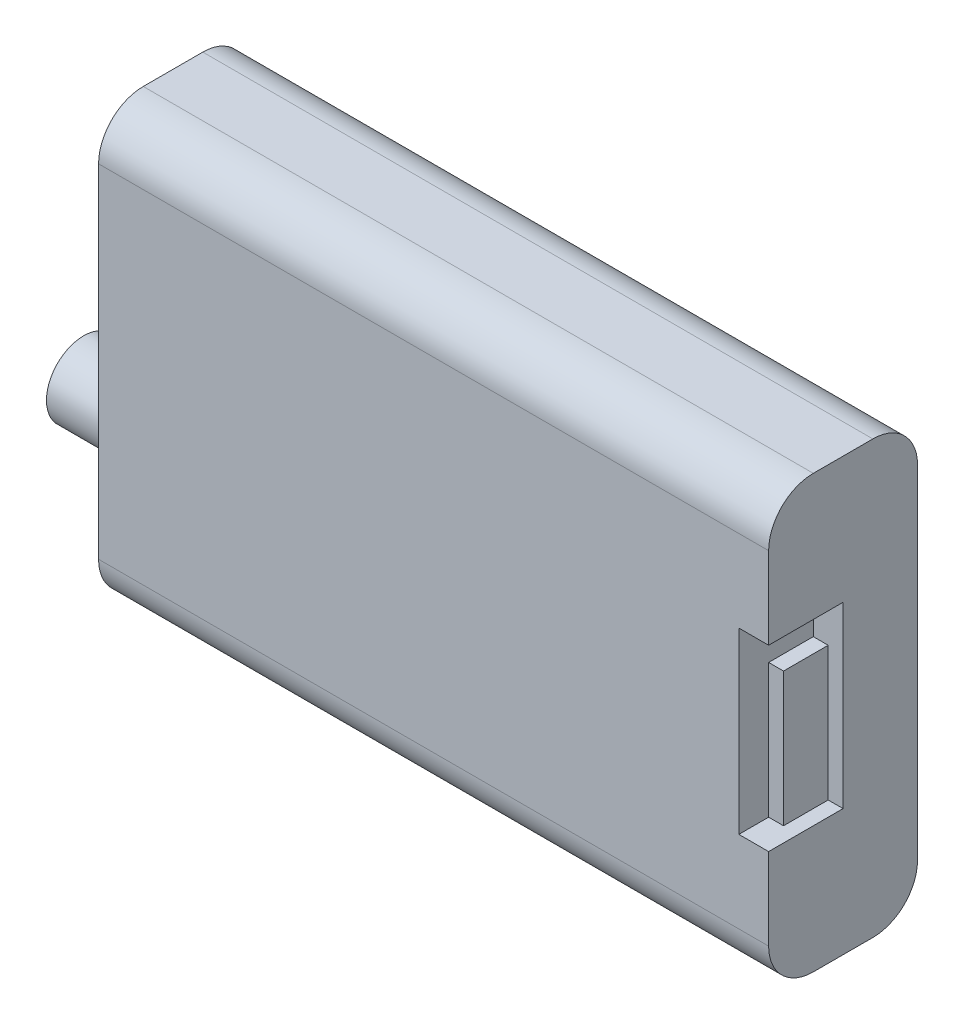
ISO-10303-21;
HEADER;
FILE_DESCRIPTION(('STEP AP214'),'2;1');
FILE_NAME('part.step','',(''),(''),'','','');
FILE_SCHEMA(('AUTOMOTIVE_DESIGN { 1 0 10303 214 1 1 1 1 }'));
ENDSEC;
DATA;
#1=APPLICATION_CONTEXT('core data for automotive mechanical design processes');
#2=APPLICATION_PROTOCOL_DEFINITION('international standard','automotive_design',2000,#1);
#3=PRODUCT_CONTEXT('',#1,'mechanical');
#4=PRODUCT('Part','Part','',(#3));
#5=PRODUCT_RELATED_PRODUCT_CATEGORY('part','',(#4));
#6=PRODUCT_DEFINITION_FORMATION('','',#4);
#7=PRODUCT_DEFINITION_CONTEXT('part definition',#1,'design');
#8=PRODUCT_DEFINITION('design','',#6,#7);
#9=PRODUCT_DEFINITION_SHAPE('','',#8);
#10=(LENGTH_UNIT() NAMED_UNIT(*) SI_UNIT(.MILLI.,.METRE.));
#11=(NAMED_UNIT(*) PLANE_ANGLE_UNIT() SI_UNIT($,.RADIAN.));
#12=(NAMED_UNIT(*) SI_UNIT($,.STERADIAN.) SOLID_ANGLE_UNIT());
#13=UNCERTAINTY_MEASURE_WITH_UNIT(LENGTH_MEASURE(1.E-05),#10,'distance_accuracy_value','');
#14=(GEOMETRIC_REPRESENTATION_CONTEXT(3) GLOBAL_UNCERTAINTY_ASSIGNED_CONTEXT((#13)) GLOBAL_UNIT_ASSIGNED_CONTEXT((#10,
#11,#12)) REPRESENTATION_CONTEXT('',''));
#15=CARTESIAN_POINT('',(0.,0.,0.));
#16=DIRECTION('',(0.,0.,1.));
#17=DIRECTION('',(1.,0.,0.));
#18=AXIS2_PLACEMENT_3D('',#15,#16,#17);
#19=CARTESIAN_POINT('',(-24.5,-6.5,5.));
#20=DIRECTION('',(-1.,0.,0.));
#21=DIRECTION('',(0.,0.,1.));
#22=AXIS2_PLACEMENT_3D('',#19,#20,#21);
#23=PLANE('',#22);
#24=CARTESIAN_POINT('',(-24.5,-6.5,5.));
#25=DIRECTION('',(-1.,0.,0.));
#26=DIRECTION('',(0.,0.,1.));
#27=AXIS2_PLACEMENT_3D('',#24,#25,#26);
#28=CIRCLE('',#27,1.85);
#29=CARTESIAN_POINT('',(-24.5,-6.5,6.85));
#30=VERTEX_POINT('',#29);
#31=EDGE_CURVE('E487',#30,#30,#28,.T.);
#32=ORIENTED_EDGE('',*,*,#31,.T.);
#33=EDGE_LOOP('',(#32));
#34=FACE_BOUND('',#33,.T.);
#35=CARTESIAN_POINT('',(-24.5,-6.5,5.));
#36=DIRECTION('',(-1.,0.,0.));
#37=DIRECTION('',(0.,0.,1.));
#38=AXIS2_PLACEMENT_3D('',#35,#36,#37);
#39=CIRCLE('',#38,0.275);
#40=CARTESIAN_POINT('',(-24.5,-6.5,5.275));
#41=VERTEX_POINT('',#40);
#42=EDGE_CURVE('E484',#41,#41,#39,.T.);
#43=ORIENTED_EDGE('',*,*,#42,.F.);
#44=EDGE_LOOP('',(#43));
#45=FACE_BOUND('',#44,.T.);
#46=ADVANCED_FACE('F33',(#34,#45),#23,.T.);
#47=CARTESIAN_POINT('',(-22.5,-14.5,10.));
#48=DIRECTION('',(1.,0.,0.));
#49=DIRECTION('',(0.,0.,-1.));
#50=AXIS2_PLACEMENT_3D('',#47,#48,#49);
#51=PLANE('',#50);
#52=DIRECTION('',(0.,0.,-1.));
#53=VECTOR('',#52,1.);
#54=CARTESIAN_POINT('',(-22.5,-14.5,10.));
#55=LINE('',#54,#53);
#56=CARTESIAN_POINT('',(-22.5,-14.5,7.));
#57=VERTEX_POINT('',#56);
#58=CARTESIAN_POINT('',(-22.5,-14.5,3.));
#59=VERTEX_POINT('',#58);
#60=EDGE_CURVE('E216',#57,#59,#55,.T.);
#61=ORIENTED_EDGE('',*,*,#60,.F.);
#62=CARTESIAN_POINT('',(-22.5,-11.5,7.));
#63=DIRECTION('',(1.,0.,0.));
#64=DIRECTION('',(0.,0.,-1.));
#65=AXIS2_PLACEMENT_3D('',#62,#63,#64);
#66=CIRCLE('',#65,3.);
#67=CARTESIAN_POINT('',(-22.5,-11.5,10.));
#68=VERTEX_POINT('',#67);
#69=EDGE_CURVE('E11',#57,#68,#66,.F.);
#70=ORIENTED_EDGE('',*,*,#69,.T.);
#71=DIRECTION('',(0.,-1.,0.));
#72=VECTOR('',#71,1.);
#73=CARTESIAN_POINT('',(-22.5,-14.5,10.));
#74=LINE('',#73,#72);
#75=CARTESIAN_POINT('',(-22.5,11.5,10.));
#76=VERTEX_POINT('',#75);
#77=EDGE_CURVE('E206',#76,#68,#74,.T.);
#78=ORIENTED_EDGE('',*,*,#77,.F.);
#79=CARTESIAN_POINT('',(-22.5,11.5,7.));
#80=DIRECTION('',(1.,0.,0.));
#81=DIRECTION('',(0.,0.,-1.));
#82=AXIS2_PLACEMENT_3D('',#79,#80,#81);
#83=CIRCLE('',#82,3.);
#84=CARTESIAN_POINT('',(-22.5,14.5,7.));
#85=VERTEX_POINT('',#84);
#86=EDGE_CURVE('E239',#76,#85,#83,.F.);
#87=ORIENTED_EDGE('',*,*,#86,.T.);
#88=DIRECTION('',(0.,0.,-1.));
#89=VECTOR('',#88,1.);
#90=CARTESIAN_POINT('',(-22.5,14.5,10.));
#91=LINE('',#90,#89);
#92=CARTESIAN_POINT('',(-22.5,14.5,3.));
#93=VERTEX_POINT('',#92);
#94=EDGE_CURVE('E218',#85,#93,#91,.T.);
#95=ORIENTED_EDGE('',*,*,#94,.T.);
#96=CARTESIAN_POINT('',(-22.5,11.5,3.));
#97=DIRECTION('',(1.,0.,0.));
#98=DIRECTION('',(0.,0.,-1.));
#99=AXIS2_PLACEMENT_3D('',#96,#97,#98);
#100=CIRCLE('',#99,3.);
#101=CARTESIAN_POINT('',(-22.5,11.5,0.));
#102=VERTEX_POINT('',#101);
#103=EDGE_CURVE('E228',#93,#102,#100,.F.);
#104=ORIENTED_EDGE('',*,*,#103,.T.);
#105=DIRECTION('',(0.,-1.,0.));
#106=VECTOR('',#105,1.);
#107=CARTESIAN_POINT('',(-22.5,-14.5,0.));
#108=LINE('',#107,#106);
#109=CARTESIAN_POINT('',(-22.5,-11.5,0.));
#110=VERTEX_POINT('',#109);
#111=EDGE_CURVE('E212',#102,#110,#108,.T.);
#112=ORIENTED_EDGE('',*,*,#111,.T.);
#113=CARTESIAN_POINT('',(-22.5,-11.5,3.));
#114=DIRECTION('',(1.,0.,0.));
#115=DIRECTION('',(0.,0.,-1.));
#116=AXIS2_PLACEMENT_3D('',#113,#114,#115);
#117=CIRCLE('',#116,3.);
#118=EDGE_CURVE('E252',#110,#59,#117,.F.);
#119=ORIENTED_EDGE('',*,*,#118,.T.);
#120=EDGE_LOOP('',(#61,#70,#78,#87,#95,#104,#112,#119));
#121=FACE_BOUND('',#120,.T.);
#122=CARTESIAN_POINT('',(-22.5,-6.5,5.));
#123=DIRECTION('',(1.,0.,0.));
#124=DIRECTION('',(0.,0.,-1.));
#125=AXIS2_PLACEMENT_3D('',#122,#123,#124);
#126=CIRCLE('',#125,2.5);
#127=CARTESIAN_POINT('',(-22.5,-6.5,2.5));
#128=VERTEX_POINT('',#127);
#129=EDGE_CURVE('E222',#128,#128,#126,.F.);
#130=ORIENTED_EDGE('',*,*,#129,.F.);
#131=EDGE_LOOP('',(#130));
#132=FACE_BOUND('',#131,.T.);
#133=ADVANCED_FACE('F286',(#121,#132),#51,.F.);
#134=CARTESIAN_POINT('',(22.5,-6.,5.));
#135=DIRECTION('',(0.,-1.,0.));
#136=DIRECTION('',(0.,0.,-1.));
#137=AXIS2_PLACEMENT_3D('',#134,#135,#136);
#138=PLANE('',#137);
#139=DIRECTION('',(-1.,0.,0.));
#140=VECTOR('',#139,1.);
#141=CARTESIAN_POINT('',(21.5,-6.,8.));
#142=LINE('',#141,#140);
#143=CARTESIAN_POINT('',(21.5,-6.,8.));
#144=VERTEX_POINT('',#143);
#145=CARTESIAN_POINT('',(20.5,-6.,8.));
#146=VERTEX_POINT('',#145);
#147=EDGE_CURVE('E151',#144,#146,#142,.T.);
#148=ORIENTED_EDGE('',*,*,#147,.T.);
#149=DIRECTION('',(0.,0.,1.));
#150=VECTOR('',#149,1.);
#151=CARTESIAN_POINT('',(20.5,-6.,5.));
#152=LINE('',#151,#150);
#153=CARTESIAN_POINT('',(20.5,-6.,10.));
#154=VERTEX_POINT('',#153);
#155=EDGE_CURVE('E199',#146,#154,#152,.T.);
#156=ORIENTED_EDGE('',*,*,#155,.T.);
#157=DIRECTION('',(1.,0.,0.));
#158=VECTOR('',#157,1.);
#159=CARTESIAN_POINT('',(22.5,-6.,10.));
#160=LINE('',#159,#158);
#161=CARTESIAN_POINT('',(22.5,-6.,10.));
#162=VERTEX_POINT('',#161);
#163=EDGE_CURVE('E180',#154,#162,#160,.T.);
#164=ORIENTED_EDGE('',*,*,#163,.T.);
#165=DIRECTION('',(0.,0.,1.));
#166=VECTOR('',#165,1.);
#167=CARTESIAN_POINT('',(22.5,-6.,5.));
#168=LINE('',#167,#166);
#169=CARTESIAN_POINT('',(22.5,-6.,5.));
#170=VERTEX_POINT('',#169);
#171=EDGE_CURVE('E195',#170,#162,#168,.T.);
#172=ORIENTED_EDGE('',*,*,#171,.F.);
#173=DIRECTION('',(1.,0.,0.));
#174=VECTOR('',#173,1.);
#175=CARTESIAN_POINT('',(22.5,-6.,5.));
#176=LINE('',#175,#174);
#177=CARTESIAN_POINT('',(21.5,-6.,5.));
#178=VERTEX_POINT('',#177);
#179=EDGE_CURVE('E163',#178,#170,#176,.T.);
#180=ORIENTED_EDGE('',*,*,#179,.F.);
#181=DIRECTION('',(0.,0.,-1.));
#182=VECTOR('',#181,1.);
#183=CARTESIAN_POINT('',(21.5,-6.,8.));
#184=LINE('',#183,#182);
#185=EDGE_CURVE('E141',#144,#178,#184,.T.);
#186=ORIENTED_EDGE('',*,*,#185,.F.);
#187=EDGE_LOOP('',(#148,#156,#164,#172,#180,#186));
#188=FACE_BOUND('',#187,.T.);
#189=ADVANCED_FACE('F161',(#188),#138,.F.);
#190=CARTESIAN_POINT('',(20.5,-6.,5.));
#191=DIRECTION('',(-1.,0.,0.));
#192=DIRECTION('',(0.,0.,1.));
#193=AXIS2_PLACEMENT_3D('',#190,#191,#192);
#194=PLANE('',#193);
#195=DIRECTION('',(0.,-1.,0.));
#196=VECTOR('',#195,1.);
#197=CARTESIAN_POINT('',(20.5,-6.,8.));
#198=LINE('',#197,#196);
#199=CARTESIAN_POINT('',(20.5,3.,8.));
#200=VERTEX_POINT('',#199);
#201=EDGE_CURVE('E154',#200,#146,#198,.T.);
#202=ORIENTED_EDGE('',*,*,#201,.F.);
#203=DIRECTION('',(0.,0.,1.));
#204=VECTOR('',#203,1.);
#205=CARTESIAN_POINT('',(20.5,3.,8.));
#206=LINE('',#205,#204);
#207=CARTESIAN_POINT('',(20.5,3.,5.));
#208=VERTEX_POINT('',#207);
#209=EDGE_CURVE('E148',#208,#200,#206,.T.);
#210=ORIENTED_EDGE('',*,*,#209,.F.);
#211=DIRECTION('',(0.,-1.,0.));
#212=VECTOR('',#211,1.);
#213=CARTESIAN_POINT('',(20.5,-6.,5.));
#214=LINE('',#213,#212);
#215=CARTESIAN_POINT('',(20.5,6.,5.));
#216=VERTEX_POINT('',#215);
#217=EDGE_CURVE('E183',#216,#208,#214,.T.);
#218=ORIENTED_EDGE('',*,*,#217,.F.);
#219=DIRECTION('',(0.,0.,1.));
#220=VECTOR('',#219,1.);
#221=CARTESIAN_POINT('',(20.5,6.,5.));
#222=LINE('',#221,#220);
#223=CARTESIAN_POINT('',(20.5,6.,10.));
#224=VERTEX_POINT('',#223);
#225=EDGE_CURVE('E201',#216,#224,#222,.T.);
#226=ORIENTED_EDGE('',*,*,#225,.T.);
#227=DIRECTION('',(0.,-1.,0.));
#228=VECTOR('',#227,1.);
#229=CARTESIAN_POINT('',(20.5,-6.,10.));
#230=LINE('',#229,#228);
#231=EDGE_CURVE('E190',#224,#154,#230,.T.);
#232=ORIENTED_EDGE('',*,*,#231,.T.);
#233=ORIENTED_EDGE('',*,*,#155,.F.);
#234=EDGE_LOOP('',(#202,#210,#218,#226,#232,#233));
#235=FACE_BOUND('',#234,.T.);
#236=ADVANCED_FACE('F273',(#235),#194,.F.);
#237=CARTESIAN_POINT('',(0.,0.,5.));
#238=DIRECTION('',(0.,0.,1.));
#239=DIRECTION('',(1.,0.,0.));
#240=AXIS2_PLACEMENT_3D('',#237,#238,#239);
#241=PLANE('',#240);
#242=ORIENTED_EDGE('',*,*,#217,.T.);
#243=DIRECTION('',(-1.,0.,0.));
#244=VECTOR('',#243,1.);
#245=CARTESIAN_POINT('',(21.5,3.,5.));
#246=LINE('',#245,#244);
#247=CARTESIAN_POINT('',(21.5,3.,5.));
#248=VERTEX_POINT('',#247);
#249=EDGE_CURVE('E158',#248,#208,#246,.T.);
#250=ORIENTED_EDGE('',*,*,#249,.F.);
#251=DIRECTION('',(0.,1.,0.));
#252=VECTOR('',#251,1.);
#253=CARTESIAN_POINT('',(21.5,-6.,5.));
#254=LINE('',#253,#252);
#255=EDGE_CURVE('E164',#178,#248,#254,.T.);
#256=ORIENTED_EDGE('',*,*,#255,.F.);
#257=ORIENTED_EDGE('',*,*,#179,.T.);
#258=DIRECTION('',(0.,1.,0.));
#259=VECTOR('',#258,1.);
#260=CARTESIAN_POINT('',(22.5,-6.,5.));
#261=LINE('',#260,#259);
#262=CARTESIAN_POINT('',(22.5,6.,5.));
#263=VERTEX_POINT('',#262);
#264=EDGE_CURVE('E176',#170,#263,#261,.T.);
#265=ORIENTED_EDGE('',*,*,#264,.T.);
#266=DIRECTION('',(-1.,0.,0.));
#267=VECTOR('',#266,1.);
#268=CARTESIAN_POINT('',(22.5,6.,5.));
#269=LINE('',#268,#267);
#270=EDGE_CURVE('E179',#263,#216,#269,.T.);
#271=ORIENTED_EDGE('',*,*,#270,.T.);
#272=EDGE_LOOP('',(#242,#250,#256,#257,#265,#271));
#273=FACE_BOUND('',#272,.T.);
#274=ADVANCED_FACE('F343',(#273),#241,.T.);
#275=CARTESIAN_POINT('',(22.5,-14.5,10.));
#276=DIRECTION('',(-1.,0.,0.));
#277=DIRECTION('',(0.,0.,1.));
#278=AXIS2_PLACEMENT_3D('',#275,#276,#277);
#279=PLANE('',#278);
#280=DIRECTION('',(0.,1.,0.));
#281=VECTOR('',#280,1.);
#282=CARTESIAN_POINT('',(22.5,-14.5,10.));
#283=LINE('',#282,#281);
#284=CARTESIAN_POINT('',(22.5,-11.5,10.));
#285=VERTEX_POINT('',#284);
#286=EDGE_CURVE('E204',#285,#162,#283,.T.);
#287=ORIENTED_EDGE('',*,*,#286,.F.);
#288=CARTESIAN_POINT('',(22.5,-11.5,7.));
#289=DIRECTION('',(-1.,0.,0.));
#290=DIRECTION('',(0.,0.,1.));
#291=AXIS2_PLACEMENT_3D('',#288,#289,#290);
#292=CIRCLE('',#291,3.);
#293=CARTESIAN_POINT('',(22.5,-14.5,7.));
#294=VERTEX_POINT('',#293);
#295=EDGE_CURVE('E55',#285,#294,#292,.F.);
#296=ORIENTED_EDGE('',*,*,#295,.T.);
#297=DIRECTION('',(0.,0.,-1.));
#298=VECTOR('',#297,1.);
#299=CARTESIAN_POINT('',(22.5,-14.5,10.));
#300=LINE('',#299,#298);
#301=CARTESIAN_POINT('',(22.5,-14.5,3.));
#302=VERTEX_POINT('',#301);
#303=EDGE_CURVE('E210',#294,#302,#300,.T.);
#304=ORIENTED_EDGE('',*,*,#303,.T.);
#305=CARTESIAN_POINT('',(22.5,-11.5,3.));
#306=DIRECTION('',(-1.,0.,0.));
#307=DIRECTION('',(0.,0.,1.));
#308=AXIS2_PLACEMENT_3D('',#305,#306,#307);
#309=CIRCLE('',#308,3.);
#310=CARTESIAN_POINT('',(22.5,-11.5,0.));
#311=VERTEX_POINT('',#310);
#312=EDGE_CURVE('E248',#302,#311,#309,.F.);
#313=ORIENTED_EDGE('',*,*,#312,.T.);
#314=DIRECTION('',(0.,1.,0.));
#315=VECTOR('',#314,1.);
#316=CARTESIAN_POINT('',(22.5,-14.5,0.));
#317=LINE('',#316,#315);
#318=CARTESIAN_POINT('',(22.5,11.5,0.));
#319=VERTEX_POINT('',#318);
#320=EDGE_CURVE('E198',#311,#319,#317,.T.);
#321=ORIENTED_EDGE('',*,*,#320,.T.);
#322=CARTESIAN_POINT('',(22.5,11.5,3.));
#323=DIRECTION('',(-1.,0.,0.));
#324=DIRECTION('',(0.,0.,1.));
#325=AXIS2_PLACEMENT_3D('',#322,#323,#324);
#326=CIRCLE('',#325,3.);
#327=CARTESIAN_POINT('',(22.5,14.5,3.));
#328=VERTEX_POINT('',#327);
#329=EDGE_CURVE('E233',#319,#328,#326,.F.);
#330=ORIENTED_EDGE('',*,*,#329,.T.);
#331=DIRECTION('',(0.,0.,-1.));
#332=VECTOR('',#331,1.);
#333=CARTESIAN_POINT('',(22.5,14.5,10.));
#334=LINE('',#333,#332);
#335=CARTESIAN_POINT('',(22.5,14.5,7.));
#336=VERTEX_POINT('',#335);
#337=EDGE_CURVE('E220',#336,#328,#334,.T.);
#338=ORIENTED_EDGE('',*,*,#337,.F.);
#339=CARTESIAN_POINT('',(22.5,11.5,7.));
#340=DIRECTION('',(-1.,0.,0.));
#341=DIRECTION('',(0.,0.,1.));
#342=AXIS2_PLACEMENT_3D('',#339,#340,#341);
#343=CIRCLE('',#342,3.);
#344=CARTESIAN_POINT('',(22.5,11.5,10.));
#345=VERTEX_POINT('',#344);
#346=EDGE_CURVE('E243',#336,#345,#343,.F.);
#347=ORIENTED_EDGE('',*,*,#346,.T.);
#348=CARTESIAN_POINT('',(22.5,5.99999999999999,10.));
#349=VERTEX_POINT('',#348);
#350=EDGE_CURVE('E207',#349,#345,#283,.T.);
#351=ORIENTED_EDGE('',*,*,#350,.F.);
#352=DIRECTION('',(0.,0.,1.));
#353=VECTOR('',#352,1.);
#354=CARTESIAN_POINT('',(22.5,6.,5.));
#355=LINE('',#354,#353);
#356=EDGE_CURVE('E187',#263,#349,#355,.T.);
#357=ORIENTED_EDGE('',*,*,#356,.F.);
#358=ORIENTED_EDGE('',*,*,#264,.F.);
#359=ORIENTED_EDGE('',*,*,#171,.T.);
#360=EDGE_LOOP('',(#287,#296,#304,#313,#321,#330,#338,#347,#351,#357,#358,#359));
#361=FACE_BOUND('',#360,.T.);
#362=ADVANCED_FACE('F265',(#361),#279,.F.);
#363=CARTESIAN_POINT('',(-22.5,14.5,10.));
#364=DIRECTION('',(0.,-1.,0.));
#365=DIRECTION('',(0.,0.,-1.));
#366=AXIS2_PLACEMENT_3D('',#363,#364,#365);
#367=PLANE('',#366);
#368=ORIENTED_EDGE('',*,*,#94,.F.);
#369=DIRECTION('',(-1.,0.,0.));
#370=VECTOR('',#369,1.);
#371=CARTESIAN_POINT('',(-22.5,14.5,7.));
#372=LINE('',#371,#370);
#373=EDGE_CURVE('E241',#85,#336,#372,.F.);
#374=ORIENTED_EDGE('',*,*,#373,.T.);
#375=ORIENTED_EDGE('',*,*,#337,.T.);
#376=DIRECTION('',(-1.,0.,0.));
#377=VECTOR('',#376,1.);
#378=CARTESIAN_POINT('',(-22.5,14.5,3.));
#379=LINE('',#378,#377);
#380=EDGE_CURVE('E225',#328,#93,#379,.T.);
#381=ORIENTED_EDGE('',*,*,#380,.T.);
#382=EDGE_LOOP('',(#368,#374,#375,#381));
#383=FACE_BOUND('',#382,.T.);
#384=ADVANCED_FACE('F290',(#383),#367,.F.);
#385=CARTESIAN_POINT('',(-22.5,-14.5,10.));
#386=DIRECTION('',(0.,1.,0.));
#387=DIRECTION('',(0.,0.,1.));
#388=AXIS2_PLACEMENT_3D('',#385,#386,#387);
#389=PLANE('',#388);
#390=ORIENTED_EDGE('',*,*,#303,.F.);
#391=DIRECTION('',(1.,0.,0.));
#392=VECTOR('',#391,1.);
#393=CARTESIAN_POINT('',(-22.5,-14.5,7.));
#394=LINE('',#393,#392);
#395=EDGE_CURVE('E41',#294,#57,#394,.F.);
#396=ORIENTED_EDGE('',*,*,#395,.T.);
#397=ORIENTED_EDGE('',*,*,#60,.T.);
#398=DIRECTION('',(1.,0.,0.));
#399=VECTOR('',#398,1.);
#400=CARTESIAN_POINT('',(22.5,-14.5,3.));
#401=LINE('',#400,#399);
#402=EDGE_CURVE('E245',#59,#302,#401,.T.);
#403=ORIENTED_EDGE('',*,*,#402,.T.);
#404=EDGE_LOOP('',(#390,#396,#397,#403));
#405=FACE_BOUND('',#404,.T.);
#406=ADVANCED_FACE('F355',(#405),#389,.F.);
#407=CARTESIAN_POINT('',(0.,0.,10.));
#408=DIRECTION('',(0.,0.,-1.));
#409=DIRECTION('',(-1.,0.,0.));
#410=AXIS2_PLACEMENT_3D('',#407,#408,#409);
#411=PLANE('',#410);
#412=ORIENTED_EDGE('',*,*,#77,.T.);
#413=DIRECTION('',(1.,0.,0.));
#414=VECTOR('',#413,1.);
#415=CARTESIAN_POINT('',(0.,-11.5,10.));
#416=LINE('',#415,#414);
#417=EDGE_CURVE('E255',#68,#285,#416,.T.);
#418=ORIENTED_EDGE('',*,*,#417,.T.);
#419=ORIENTED_EDGE('',*,*,#286,.T.);
#420=ORIENTED_EDGE('',*,*,#163,.F.);
#421=ORIENTED_EDGE('',*,*,#231,.F.);
#422=DIRECTION('',(-1.,0.,0.));
#423=VECTOR('',#422,1.);
#424=CARTESIAN_POINT('',(22.5,6.,10.));
#425=LINE('',#424,#423);
#426=EDGE_CURVE('E157',#349,#224,#425,.T.);
#427=ORIENTED_EDGE('',*,*,#426,.F.);
#428=ORIENTED_EDGE('',*,*,#350,.T.);
#429=DIRECTION('',(-1.,0.,0.));
#430=VECTOR('',#429,1.);
#431=CARTESIAN_POINT('',(0.,11.5,10.));
#432=LINE('',#431,#430);
#433=EDGE_CURVE('E236',#345,#76,#432,.T.);
#434=ORIENTED_EDGE('',*,*,#433,.T.);
#435=EDGE_LOOP('',(#412,#418,#419,#420,#421,#427,#428,#434));
#436=FACE_BOUND('',#435,.T.);
#437=ADVANCED_FACE('F260',(#436),#411,.F.);
#438=CARTESIAN_POINT('',(0.,0.,0.));
#439=DIRECTION('',(0.,0.,-1.));
#440=DIRECTION('',(-1.,0.,0.));
#441=AXIS2_PLACEMENT_3D('',#438,#439,#440);
#442=PLANE('',#441);
#443=ORIENTED_EDGE('',*,*,#320,.F.);
#444=DIRECTION('',(1.,0.,0.));
#445=VECTOR('',#444,1.);
#446=CARTESIAN_POINT('',(-22.5,-11.5,0.));
#447=LINE('',#446,#445);
#448=EDGE_CURVE('E250',#311,#110,#447,.F.);
#449=ORIENTED_EDGE('',*,*,#448,.T.);
#450=ORIENTED_EDGE('',*,*,#111,.F.);
#451=DIRECTION('',(-1.,0.,0.));
#452=VECTOR('',#451,1.);
#453=CARTESIAN_POINT('',(22.5,11.5,0.));
#454=LINE('',#453,#452);
#455=EDGE_CURVE('E230',#102,#319,#454,.F.);
#456=ORIENTED_EDGE('',*,*,#455,.T.);
#457=EDGE_LOOP('',(#443,#449,#450,#456));
#458=FACE_BOUND('',#457,.T.);
#459=ADVANCED_FACE('F300',(#458),#442,.T.);
#460=CARTESIAN_POINT('',(22.5,6.,5.));
#461=DIRECTION('',(0.,1.,0.));
#462=DIRECTION('',(0.,0.,1.));
#463=AXIS2_PLACEMENT_3D('',#460,#461,#462);
#464=PLANE('',#463);
#465=ORIENTED_EDGE('',*,*,#426,.T.);
#466=ORIENTED_EDGE('',*,*,#225,.F.);
#467=ORIENTED_EDGE('',*,*,#270,.F.);
#468=ORIENTED_EDGE('',*,*,#356,.T.);
#469=EDGE_LOOP('',(#465,#466,#467,#468));
#470=FACE_BOUND('',#469,.T.);
#471=ADVANCED_FACE('F277',(#470),#464,.F.);
#472=CARTESIAN_POINT('',(21.5,-6.,8.));
#473=DIRECTION('',(0.,0.,-1.));
#474=DIRECTION('',(-1.,0.,0.));
#475=AXIS2_PLACEMENT_3D('',#472,#473,#474);
#476=PLANE('',#475);
#477=ORIENTED_EDGE('',*,*,#201,.T.);
#478=ORIENTED_EDGE('',*,*,#147,.F.);
#479=DIRECTION('',(0.,-1.,0.));
#480=VECTOR('',#479,1.);
#481=CARTESIAN_POINT('',(21.5,-6.,8.));
#482=LINE('',#481,#480);
#483=CARTESIAN_POINT('',(21.5,3.,8.));
#484=VERTEX_POINT('',#483);
#485=EDGE_CURVE('E137',#484,#144,#482,.T.);
#486=ORIENTED_EDGE('',*,*,#485,.F.);
#487=DIRECTION('',(-1.,0.,0.));
#488=VECTOR('',#487,1.);
#489=CARTESIAN_POINT('',(21.5,3.,8.));
#490=LINE('',#489,#488);
#491=EDGE_CURVE('E170',#484,#200,#490,.T.);
#492=ORIENTED_EDGE('',*,*,#491,.T.);
#493=EDGE_LOOP('',(#477,#478,#486,#492));
#494=FACE_BOUND('',#493,.T.);
#495=ADVANCED_FACE('F152',(#494),#476,.F.);
#496=CARTESIAN_POINT('',(21.5,3.,8.));
#497=DIRECTION('',(0.,-1.,0.));
#498=DIRECTION('',(0.,0.,-1.));
#499=AXIS2_PLACEMENT_3D('',#496,#497,#498);
#500=PLANE('',#499);
#501=ORIENTED_EDGE('',*,*,#209,.T.);
#502=ORIENTED_EDGE('',*,*,#491,.F.);
#503=DIRECTION('',(0.,0.,1.));
#504=VECTOR('',#503,1.);
#505=CARTESIAN_POINT('',(21.5,3.,8.));
#506=LINE('',#505,#504);
#507=EDGE_CURVE('E144',#248,#484,#506,.T.);
#508=ORIENTED_EDGE('',*,*,#507,.F.);
#509=ORIENTED_EDGE('',*,*,#249,.T.);
#510=EDGE_LOOP('',(#501,#502,#508,#509));
#511=FACE_BOUND('',#510,.T.);
#512=ADVANCED_FACE('F337',(#511),#500,.F.);
#513=CARTESIAN_POINT('',(21.5,0.,0.));
#514=DIRECTION('',(-1.,0.,0.));
#515=DIRECTION('',(0.,0.,1.));
#516=AXIS2_PLACEMENT_3D('',#513,#514,#515);
#517=PLANE('',#516);
#518=ORIENTED_EDGE('',*,*,#485,.T.);
#519=ORIENTED_EDGE('',*,*,#185,.T.);
#520=ORIENTED_EDGE('',*,*,#255,.T.);
#521=ORIENTED_EDGE('',*,*,#507,.T.);
#522=EDGE_LOOP('',(#518,#519,#520,#521));
#523=FACE_BOUND('',#522,.T.);
#524=ADVANCED_FACE('F139',(#523),#517,.F.);
#525=CARTESIAN_POINT('',(-28.5,-6.5,5.));
#526=DIRECTION('',(1.,0.,0.));
#527=DIRECTION('',(0.,0.,-1.));
#528=AXIS2_PLACEMENT_3D('',#525,#526,#527);
#529=CYLINDRICAL_SURFACE('',#528,2.5);
#530=CARTESIAN_POINT('',(-28.5,-6.5,5.));
#531=DIRECTION('',(-1.,0.,0.));
#532=DIRECTION('',(0.,0.,1.));
#533=AXIS2_PLACEMENT_3D('',#530,#531,#532);
#534=CIRCLE('',#533,2.5);
#535=CARTESIAN_POINT('',(-28.5,-6.5,7.5));
#536=VERTEX_POINT('',#535);
#537=EDGE_CURVE('E172',#536,#536,#534,.T.);
#538=ORIENTED_EDGE('',*,*,#537,.F.);
#539=EDGE_LOOP('',(#538));
#540=FACE_BOUND('',#539,.T.);
#541=ORIENTED_EDGE('',*,*,#129,.T.);
#542=EDGE_LOOP('',(#541));
#543=FACE_BOUND('',#542,.T.);
#544=ADVANCED_FACE('F330',(#540,#543),#529,.T.);
#545=CARTESIAN_POINT('',(-28.5,-6.5,5.));
#546=DIRECTION('',(-1.,0.,0.));
#547=DIRECTION('',(0.,0.,1.));
#548=AXIS2_PLACEMENT_3D('',#545,#546,#547);
#549=PLANE('',#548);
#550=CARTESIAN_POINT('',(-28.5,-6.5,5.));
#551=DIRECTION('',(-1.,0.,0.));
#552=DIRECTION('',(0.,0.,1.));
#553=AXIS2_PLACEMENT_3D('',#550,#551,#552);
#554=CIRCLE('',#553,1.85);
#555=CARTESIAN_POINT('',(-28.5,-6.5,6.85));
#556=VERTEX_POINT('',#555);
#557=EDGE_CURVE('E483',#556,#556,#554,.T.);
#558=ORIENTED_EDGE('',*,*,#557,.F.);
#559=EDGE_LOOP('',(#558));
#560=FACE_BOUND('',#559,.T.);
#561=ORIENTED_EDGE('',*,*,#537,.T.);
#562=EDGE_LOOP('',(#561));
#563=FACE_BOUND('',#562,.T.);
#564=ADVANCED_FACE('F326',(#560,#563),#549,.T.);
#565=CARTESIAN_POINT('',(-24.5,-6.5,5.));
#566=DIRECTION('',(-1.,0.,0.));
#567=DIRECTION('',(0.,0.,1.));
#568=AXIS2_PLACEMENT_3D('',#565,#566,#567);
#569=CYLINDRICAL_SURFACE('',#568,1.85);
#570=ORIENTED_EDGE('',*,*,#31,.F.);
#571=EDGE_LOOP('',(#570));
#572=FACE_BOUND('',#571,.T.);
#573=ORIENTED_EDGE('',*,*,#557,.T.);
#574=EDGE_LOOP('',(#573));
#575=FACE_BOUND('',#574,.T.);
#576=ADVANCED_FACE('F323',(#572,#575),#569,.F.);
#577=CARTESIAN_POINT('',(-28.5,-6.5,5.));
#578=DIRECTION('',(1.,0.,0.));
#579=DIRECTION('',(0.,0.,-1.));
#580=AXIS2_PLACEMENT_3D('',#577,#578,#579);
#581=CYLINDRICAL_SURFACE('',#580,0.275);
#582=CARTESIAN_POINT('',(-28.5,-6.5,5.));
#583=DIRECTION('',(-1.,0.,0.));
#584=DIRECTION('',(0.,0.,1.));
#585=AXIS2_PLACEMENT_3D('',#582,#583,#584);
#586=CIRCLE('',#585,0.275);
#587=CARTESIAN_POINT('',(-28.5,-6.5,5.275));
#588=VERTEX_POINT('',#587);
#589=EDGE_CURVE('E482',#588,#588,#586,.T.);
#590=ORIENTED_EDGE('',*,*,#589,.F.);
#591=EDGE_LOOP('',(#590));
#592=FACE_BOUND('',#591,.T.);
#593=ORIENTED_EDGE('',*,*,#42,.T.);
#594=EDGE_LOOP('',(#593));
#595=FACE_BOUND('',#594,.T.);
#596=ADVANCED_FACE('F321',(#592,#595),#581,.T.);
#597=CARTESIAN_POINT('',(-28.5,-6.5,5.));
#598=DIRECTION('',(-1.,0.,0.));
#599=DIRECTION('',(0.,0.,1.));
#600=AXIS2_PLACEMENT_3D('',#597,#598,#599);
#601=PLANE('',#600);
#602=ORIENTED_EDGE('',*,*,#589,.T.);
#603=EDGE_LOOP('',(#602));
#604=FACE_BOUND('',#603,.T.);
#605=ADVANCED_FACE('F366',(#604),#601,.T.);
#606=CARTESIAN_POINT('',(-22.5,11.5,3.));
#607=DIRECTION('',(1.,0.,0.));
#608=DIRECTION('',(0.,0.,-1.));
#609=AXIS2_PLACEMENT_3D('',#606,#607,#608);
#610=CYLINDRICAL_SURFACE('',#609,3.);
#611=ORIENTED_EDGE('',*,*,#329,.F.);
#612=ORIENTED_EDGE('',*,*,#455,.F.);
#613=ORIENTED_EDGE('',*,*,#103,.F.);
#614=ORIENTED_EDGE('',*,*,#380,.F.);
#615=EDGE_LOOP('',(#611,#612,#613,#614));
#616=FACE_BOUND('',#615,.T.);
#617=ADVANCED_FACE('F294',(#616),#610,.T.);
#618=CARTESIAN_POINT('',(0.,11.5,7.));
#619=DIRECTION('',(-1.,0.,0.));
#620=DIRECTION('',(0.,0.,1.));
#621=AXIS2_PLACEMENT_3D('',#618,#619,#620);
#622=CYLINDRICAL_SURFACE('',#621,3.);
#623=ORIENTED_EDGE('',*,*,#346,.F.);
#624=ORIENTED_EDGE('',*,*,#373,.F.);
#625=ORIENTED_EDGE('',*,*,#86,.F.);
#626=ORIENTED_EDGE('',*,*,#433,.F.);
#627=EDGE_LOOP('',(#623,#624,#625,#626));
#628=FACE_BOUND('',#627,.T.);
#629=ADVANCED_FACE('F282',(#628),#622,.T.);
#630=CARTESIAN_POINT('',(-22.5,-11.5,3.));
#631=DIRECTION('',(-1.,0.,0.));
#632=DIRECTION('',(0.,0.,1.));
#633=AXIS2_PLACEMENT_3D('',#630,#631,#632);
#634=CYLINDRICAL_SURFACE('',#633,3.);
#635=ORIENTED_EDGE('',*,*,#118,.F.);
#636=ORIENTED_EDGE('',*,*,#448,.F.);
#637=ORIENTED_EDGE('',*,*,#312,.F.);
#638=ORIENTED_EDGE('',*,*,#402,.F.);
#639=EDGE_LOOP('',(#635,#636,#637,#638));
#640=FACE_BOUND('',#639,.T.);
#641=ADVANCED_FACE('F304',(#640),#634,.T.);
#642=CARTESIAN_POINT('',(0.,-11.5,7.));
#643=DIRECTION('',(1.,0.,0.));
#644=DIRECTION('',(0.,0.,-1.));
#645=AXIS2_PLACEMENT_3D('',#642,#643,#644);
#646=CYLINDRICAL_SURFACE('',#645,3.);
#647=ORIENTED_EDGE('',*,*,#69,.F.);
#648=ORIENTED_EDGE('',*,*,#395,.F.);
#649=ORIENTED_EDGE('',*,*,#295,.F.);
#650=ORIENTED_EDGE('',*,*,#417,.F.);
#651=EDGE_LOOP('',(#647,#648,#649,#650));
#652=FACE_BOUND('',#651,.T.);
#653=ADVANCED_FACE('F35',(#652),#646,.T.);
#654=CLOSED_SHELL('',(#46,#133,#189,#236,#274,#362,#384,#406,#437,#459,#471,#495,#512,#524,#544,
#564,#576,#596,#605,#617,#629,#641,#653));
#655=MANIFOLD_SOLID_BREP('B2',#654);
#656=ADVANCED_BREP_SHAPE_REPRESENTATION('',(#18,#655),#14);
#657=SHAPE_DEFINITION_REPRESENTATION(#9,#656);
ENDSEC;
END-ISO-10303-21;
